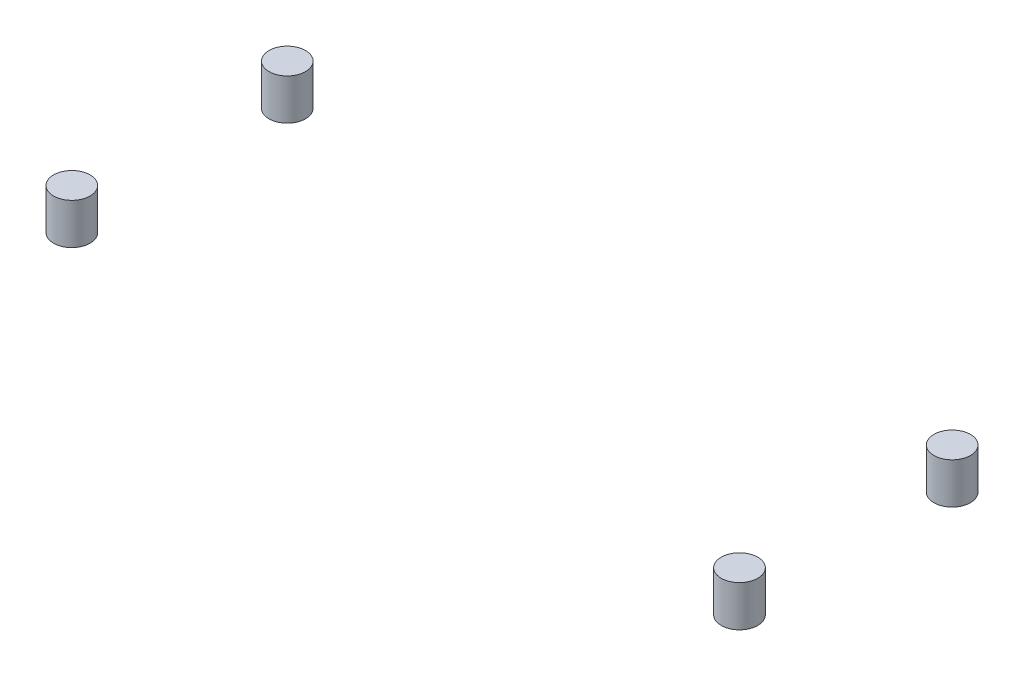
ISO-10303-21;
HEADER;
FILE_DESCRIPTION(('STEP AP214'),'2;1');
FILE_NAME('part.step','',(''),(''),'','','');
FILE_SCHEMA(('AUTOMOTIVE_DESIGN { 1 0 10303 214 1 1 1 1 }'));
ENDSEC;
DATA;
#1=APPLICATION_CONTEXT('core data for automotive mechanical design processes');
#2=APPLICATION_PROTOCOL_DEFINITION('international standard','automotive_design',2000,#1);
#3=PRODUCT_CONTEXT('',#1,'mechanical');
#4=PRODUCT('Part','Part','',(#3));
#5=PRODUCT_RELATED_PRODUCT_CATEGORY('part','',(#4));
#6=PRODUCT_DEFINITION_FORMATION('','',#4);
#7=PRODUCT_DEFINITION_CONTEXT('part definition',#1,'design');
#8=PRODUCT_DEFINITION('design','',#6,#7);
#9=PRODUCT_DEFINITION_SHAPE('','',#8);
#10=(LENGTH_UNIT() NAMED_UNIT(*) SI_UNIT(.MILLI.,.METRE.));
#11=(NAMED_UNIT(*) PLANE_ANGLE_UNIT() SI_UNIT($,.RADIAN.));
#12=(NAMED_UNIT(*) SI_UNIT($,.STERADIAN.) SOLID_ANGLE_UNIT());
#13=UNCERTAINTY_MEASURE_WITH_UNIT(LENGTH_MEASURE(1.E-05),#10,'distance_accuracy_value','');
#14=(GEOMETRIC_REPRESENTATION_CONTEXT(3) GLOBAL_UNCERTAINTY_ASSIGNED_CONTEXT((#13)) GLOBAL_UNIT_ASSIGNED_CONTEXT((#10,
#11,#12)) REPRESENTATION_CONTEXT('',''));
#15=CARTESIAN_POINT('',(0.,0.,0.));
#16=DIRECTION('',(0.,0.,1.));
#17=DIRECTION('',(1.,0.,0.));
#18=AXIS2_PLACEMENT_3D('',#15,#16,#17);
#19=CARTESIAN_POINT('',(152.201551006959,123.772945221418,127.758147990631));
#20=DIRECTION('',(0.,-1.,7.25237772614129E-10));
#21=DIRECTION('',(0.,-7.25237772614129E-10,-1.));
#22=AXIS2_PLACEMENT_3D('',#19,#20,#21);
#23=CYLINDRICAL_SURFACE('',#22,2.5);
#24=CARTESIAN_POINT('',(152.201551006959,123.772945221418,127.758147990631));
#25=DIRECTION('',(0.,1.,-7.25237772614129E-10));
#26=DIRECTION('',(0.,7.25237772614129E-10,1.));
#27=AXIS2_PLACEMENT_3D('',#24,#25,#26);
#28=CIRCLE('',#27,2.5);
#29=CARTESIAN_POINT('',(152.201551006959,123.772945223231,130.258147990631));
#30=VERTEX_POINT('',#29);
#31=EDGE_CURVE('E11',#30,#30,#28,.T.);
#32=ORIENTED_EDGE('',*,*,#31,.F.);
#33=EDGE_LOOP('',(#32));
#34=FACE_BOUND('',#33,.T.);
#35=CARTESIAN_POINT('',(152.201551006959,118.172945221418,127.758147994693));
#36=DIRECTION('',(0.,1.,-7.25237772614129E-10));
#37=DIRECTION('',(0.,7.25237772614129E-10,1.));
#38=AXIS2_PLACEMENT_3D('',#35,#36,#37);
#39=CIRCLE('',#38,2.5);
#40=CARTESIAN_POINT('',(152.201551006959,118.172945223231,130.258147994693));
#41=VERTEX_POINT('',#40);
#42=EDGE_CURVE('E43',#41,#41,#39,.T.);
#43=ORIENTED_EDGE('',*,*,#42,.T.);
#44=EDGE_LOOP('',(#43));
#45=FACE_BOUND('',#44,.T.);
#46=ADVANCED_FACE('F40',(#34,#45),#23,.T.);
#47=CARTESIAN_POINT('',(152.201551006959,123.772945221418,127.758147990631));
#48=DIRECTION('',(0.,1.,-7.25237772614129E-10));
#49=DIRECTION('',(0.,7.25237772614129E-10,1.));
#50=AXIS2_PLACEMENT_3D('',#47,#48,#49);
#51=PLANE('',#50);
#52=ORIENTED_EDGE('',*,*,#31,.T.);
#53=EDGE_LOOP('',(#52));
#54=FACE_BOUND('',#53,.T.);
#55=ADVANCED_FACE('F55',(#54),#51,.T.);
#56=CARTESIAN_POINT('',(152.201551006959,118.172945221418,127.758147994693));
#57=DIRECTION('',(0.,1.,-7.25237772614129E-10));
#58=DIRECTION('',(0.,7.25237772614129E-10,1.));
#59=AXIS2_PLACEMENT_3D('',#56,#57,#58);
#60=PLANE('',#59);
#61=ORIENTED_EDGE('',*,*,#42,.F.);
#62=EDGE_LOOP('',(#61));
#63=FACE_BOUND('',#62,.T.);
#64=ADVANCED_FACE('F53',(#63),#60,.F.);
#65=CLOSED_SHELL('',(#46,#55,#64));
#66=MANIFOLD_SOLID_BREP('B2',#65);
#67=CARTESIAN_POINT('',(61.2695510069592,123.772945221694,128.139147990631));
#68=DIRECTION('',(0.,-1.,7.25237772614129E-10));
#69=DIRECTION('',(0.,-7.25237772614129E-10,-1.));
#70=AXIS2_PLACEMENT_3D('',#67,#68,#69);
#71=CYLINDRICAL_SURFACE('',#70,2.50000000000002);
#72=CARTESIAN_POINT('',(61.2695510069592,123.772945221694,128.139147990631));
#73=DIRECTION('',(0.,1.,-7.25237772614129E-10));
#74=DIRECTION('',(0.,7.25237772614129E-10,1.));
#75=AXIS2_PLACEMENT_3D('',#72,#73,#74);
#76=CIRCLE('',#75,2.50000000000002);
#77=CARTESIAN_POINT('',(61.2695510069592,123.772945223507,130.639147990631));
#78=VERTEX_POINT('',#77);
#79=EDGE_CURVE('E39',#78,#78,#76,.T.);
#80=ORIENTED_EDGE('',*,*,#79,.F.);
#81=EDGE_LOOP('',(#80));
#82=FACE_BOUND('',#81,.T.);
#83=CARTESIAN_POINT('',(61.2695510069592,118.172945221694,128.139147994693));
#84=DIRECTION('',(0.,1.,-7.25237772614129E-10));
#85=DIRECTION('',(0.,7.25237772614129E-10,1.));
#86=AXIS2_PLACEMENT_3D('',#83,#84,#85);
#87=CIRCLE('',#86,2.50000000000002);
#88=CARTESIAN_POINT('',(61.2695510069592,118.172945223507,130.639147994693));
#89=VERTEX_POINT('',#88);
#90=EDGE_CURVE('E92',#89,#89,#87,.T.);
#91=ORIENTED_EDGE('',*,*,#90,.T.);
#92=EDGE_LOOP('',(#91));
#93=FACE_BOUND('',#92,.T.);
#94=ADVANCED_FACE('F89',(#82,#93),#71,.T.);
#95=CARTESIAN_POINT('',(61.2695510069592,123.772945221694,128.139147990631));
#96=DIRECTION('',(0.,1.,-7.25237772614129E-10));
#97=DIRECTION('',(0.,7.25237772614129E-10,1.));
#98=AXIS2_PLACEMENT_3D('',#95,#96,#97);
#99=PLANE('',#98);
#100=ORIENTED_EDGE('',*,*,#79,.T.);
#101=EDGE_LOOP('',(#100));
#102=FACE_BOUND('',#101,.T.);
#103=ADVANCED_FACE('F104',(#102),#99,.T.);
#104=CARTESIAN_POINT('',(61.2695510069592,118.172945221694,128.139147994693));
#105=DIRECTION('',(0.,1.,-7.25237772614129E-10));
#106=DIRECTION('',(0.,7.25237772614129E-10,1.));
#107=AXIS2_PLACEMENT_3D('',#104,#105,#106);
#108=PLANE('',#107);
#109=ORIENTED_EDGE('',*,*,#90,.F.);
#110=EDGE_LOOP('',(#109));
#111=FACE_BOUND('',#110,.T.);
#112=ADVANCED_FACE('F102',(#111),#108,.F.);
#113=CLOSED_SHELL('',(#94,#103,#112));
#114=MANIFOLD_SOLID_BREP('B6',#113);
#115=CARTESIAN_POINT('',(152.201551006959,123.772945200326,98.6751479906313));
#116=DIRECTION('',(0.,-1.,7.25237772614129E-10));
#117=DIRECTION('',(0.,-7.25237772614129E-10,-1.));
#118=AXIS2_PLACEMENT_3D('',#115,#116,#117);
#119=CYLINDRICAL_SURFACE('',#118,2.5);
#120=CARTESIAN_POINT('',(152.201551006959,123.772945200326,98.6751479906313));
#121=DIRECTION('',(0.,1.,-7.25237772614129E-10));
#122=DIRECTION('',(0.,7.25237772614129E-10,1.));
#123=AXIS2_PLACEMENT_3D('',#120,#121,#122);
#124=CIRCLE('',#123,2.5);
#125=CARTESIAN_POINT('',(152.201551006959,123.772945202139,101.175147990631));
#126=VERTEX_POINT('',#125);
#127=EDGE_CURVE('E88',#126,#126,#124,.T.);
#128=ORIENTED_EDGE('',*,*,#127,.F.);
#129=EDGE_LOOP('',(#128));
#130=FACE_BOUND('',#129,.T.);
#131=CARTESIAN_POINT('',(152.201551006959,118.172945200326,98.6751479946927));
#132=DIRECTION('',(0.,1.,-7.25237772614129E-10));
#133=DIRECTION('',(0.,7.25237772614129E-10,1.));
#134=AXIS2_PLACEMENT_3D('',#131,#132,#133);
#135=CIRCLE('',#134,2.5);
#136=CARTESIAN_POINT('',(152.201551006959,118.172945202139,101.175147994693));
#137=VERTEX_POINT('',#136);
#138=EDGE_CURVE('E140',#137,#137,#135,.T.);
#139=ORIENTED_EDGE('',*,*,#138,.T.);
#140=EDGE_LOOP('',(#139));
#141=FACE_BOUND('',#140,.T.);
#142=ADVANCED_FACE('F137',(#130,#141),#119,.T.);
#143=CARTESIAN_POINT('',(152.201551006959,123.772945200326,98.6751479906313));
#144=DIRECTION('',(0.,1.,-7.25237772614129E-10));
#145=DIRECTION('',(0.,7.25237772614129E-10,1.));
#146=AXIS2_PLACEMENT_3D('',#143,#144,#145);
#147=PLANE('',#146);
#148=ORIENTED_EDGE('',*,*,#127,.T.);
#149=EDGE_LOOP('',(#148));
#150=FACE_BOUND('',#149,.T.);
#151=ADVANCED_FACE('F152',(#150),#147,.T.);
#152=CARTESIAN_POINT('',(152.201551006959,118.172945200326,98.6751479946927));
#153=DIRECTION('',(0.,1.,-7.25237772614129E-10));
#154=DIRECTION('',(0.,7.25237772614129E-10,1.));
#155=AXIS2_PLACEMENT_3D('',#152,#153,#154);
#156=PLANE('',#155);
#157=ORIENTED_EDGE('',*,*,#138,.F.);
#158=EDGE_LOOP('',(#157));
#159=FACE_BOUND('',#158,.T.);
#160=ADVANCED_FACE('F150',(#159),#156,.F.);
#161=CLOSED_SHELL('',(#142,#151,#160));
#162=MANIFOLD_SOLID_BREP('B34',#161);
#163=CARTESIAN_POINT('',(61.2695510069592,123.772945200326,98.6751479906314));
#164=DIRECTION('',(0.,-1.,7.25237772614129E-10));
#165=DIRECTION('',(0.,-7.25237772614129E-10,-1.));
#166=AXIS2_PLACEMENT_3D('',#163,#164,#165);
#167=CYLINDRICAL_SURFACE('',#166,2.50000000000002);
#168=CARTESIAN_POINT('',(61.2695510069592,123.772945200326,98.6751479906314));
#169=DIRECTION('',(0.,1.,-7.25237772614129E-10));
#170=DIRECTION('',(0.,7.25237772614129E-10,1.));
#171=AXIS2_PLACEMENT_3D('',#168,#169,#170);
#172=CIRCLE('',#171,2.50000000000002);
#173=CARTESIAN_POINT('',(61.2695510069592,123.772945202139,101.175147990631));
#174=VERTEX_POINT('',#173);
#175=EDGE_CURVE('E136',#174,#174,#172,.T.);
#176=ORIENTED_EDGE('',*,*,#175,.F.);
#177=EDGE_LOOP('',(#176));
#178=FACE_BOUND('',#177,.T.);
#179=CARTESIAN_POINT('',(61.2695510069592,118.172945200326,98.6751479946927));
#180=DIRECTION('',(0.,1.,-7.25237772614129E-10));
#181=DIRECTION('',(0.,7.25237772614129E-10,1.));
#182=AXIS2_PLACEMENT_3D('',#179,#180,#181);
#183=CIRCLE('',#182,2.50000000000002);
#184=CARTESIAN_POINT('',(61.2695510069592,118.172945202139,101.175147994693));
#185=VERTEX_POINT('',#184);
#186=EDGE_CURVE('E181',#185,#185,#183,.T.);
#187=ORIENTED_EDGE('',*,*,#186,.T.);
#188=EDGE_LOOP('',(#187));
#189=FACE_BOUND('',#188,.T.);
#190=ADVANCED_FACE('F178',(#178,#189),#167,.T.);
#191=CARTESIAN_POINT('',(61.2695510069592,123.772945200326,98.6751479906314));
#192=DIRECTION('',(0.,1.,-7.25237772614129E-10));
#193=DIRECTION('',(0.,7.25237772614129E-10,1.));
#194=AXIS2_PLACEMENT_3D('',#191,#192,#193);
#195=PLANE('',#194);
#196=ORIENTED_EDGE('',*,*,#175,.T.);
#197=EDGE_LOOP('',(#196));
#198=FACE_BOUND('',#197,.T.);
#199=ADVANCED_FACE('F193',(#198),#195,.T.);
#200=CARTESIAN_POINT('',(61.2695510069592,118.172945200326,98.6751479946927));
#201=DIRECTION('',(0.,1.,-7.25237772614129E-10));
#202=DIRECTION('',(0.,7.25237772614129E-10,1.));
#203=AXIS2_PLACEMENT_3D('',#200,#201,#202);
#204=PLANE('',#203);
#205=ORIENTED_EDGE('',*,*,#186,.F.);
#206=EDGE_LOOP('',(#205));
#207=FACE_BOUND('',#206,.T.);
#208=ADVANCED_FACE('F191',(#207),#204,.F.);
#209=CLOSED_SHELL('',(#190,#199,#208));
#210=MANIFOLD_SOLID_BREP('B83',#209);
#211=ADVANCED_BREP_SHAPE_REPRESENTATION('',(#18,#66,#114,#162,#210),#14);
#212=SHAPE_DEFINITION_REPRESENTATION(#9,#211);
ENDSEC;
END-ISO-10303-21;
